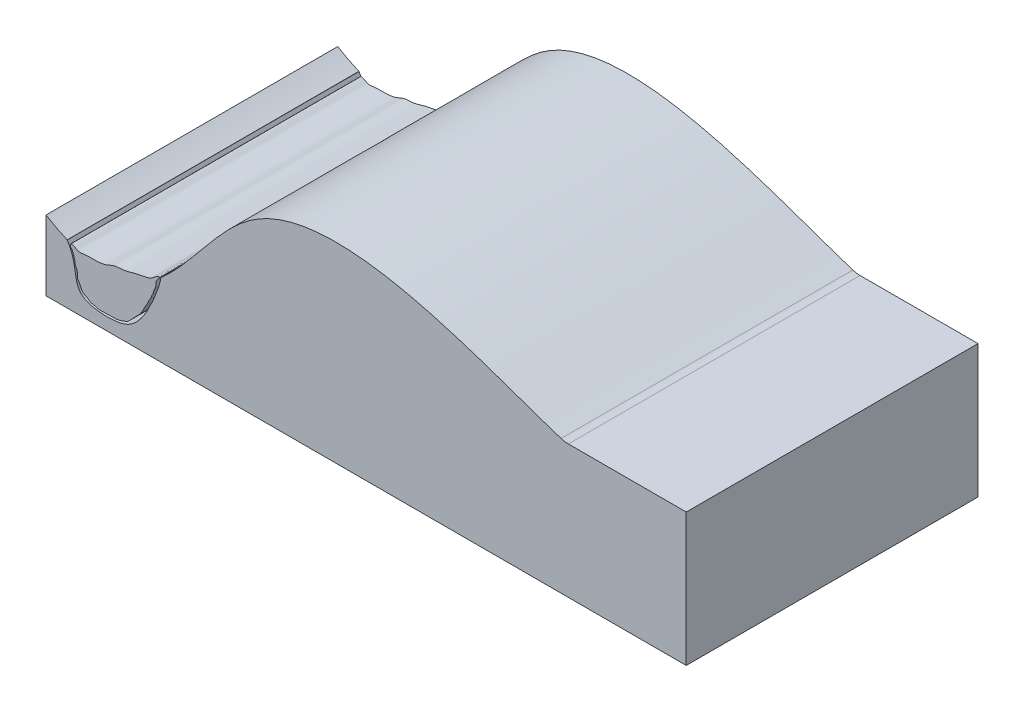
ISO-10303-21;
HEADER;
FILE_DESCRIPTION(('STEP AP214'),'2;1');
FILE_NAME('part.step','',(''),(''),'','','');
FILE_SCHEMA(('AUTOMOTIVE_DESIGN { 1 0 10303 214 1 1 1 1 }'));
ENDSEC;
DATA;
#1=APPLICATION_CONTEXT('core data for automotive mechanical design processes');
#2=APPLICATION_PROTOCOL_DEFINITION('international standard','automotive_design',2000,#1);
#3=PRODUCT_CONTEXT('',#1,'mechanical');
#4=PRODUCT('Part','Part','',(#3));
#5=PRODUCT_RELATED_PRODUCT_CATEGORY('part','',(#4));
#6=PRODUCT_DEFINITION_FORMATION('','',#4);
#7=PRODUCT_DEFINITION_CONTEXT('part definition',#1,'design');
#8=PRODUCT_DEFINITION('design','',#6,#7);
#9=PRODUCT_DEFINITION_SHAPE('','',#8);
#10=(LENGTH_UNIT() NAMED_UNIT(*) SI_UNIT(.MILLI.,.METRE.));
#11=(NAMED_UNIT(*) PLANE_ANGLE_UNIT() SI_UNIT($,.RADIAN.));
#12=(NAMED_UNIT(*) SI_UNIT($,.STERADIAN.) SOLID_ANGLE_UNIT());
#13=UNCERTAINTY_MEASURE_WITH_UNIT(LENGTH_MEASURE(1.E-05),#10,'distance_accuracy_value','');
#14=(GEOMETRIC_REPRESENTATION_CONTEXT(3) GLOBAL_UNCERTAINTY_ASSIGNED_CONTEXT((#13)) GLOBAL_UNIT_ASSIGNED_CONTEXT((#10,
#11,#12)) REPRESENTATION_CONTEXT('',''));
#15=CARTESIAN_POINT('',(0.,0.,0.));
#16=DIRECTION('',(0.,0.,1.));
#17=DIRECTION('',(1.,0.,0.));
#18=AXIS2_PLACEMENT_3D('',#15,#16,#17);
#19=CARTESIAN_POINT('',(18453.120407378,42903.9943873051,-217957.146));
#20=CARTESIAN_POINT('',(18203.1148026914,42439.5432046813,-217957.146));
#21=CARTESIAN_POINT('',(18070.7865840189,41127.0455180154,-217957.146));
#22=CARTESIAN_POINT('',(19282.2145590177,40516.7158260196,-217957.146));
#23=CARTESIAN_POINT('',(19537.7374002564,39469.7636240966,-217957.146));
#24=CARTESIAN_POINT('',(20297.8759646065,38469.1216104898,-217957.146));
#25=CARTESIAN_POINT('',(20759.1419337716,37218.3682673327,-217957.146));
#26=CARTESIAN_POINT('',(21089.9603759941,36107.5250728247,-217957.146));
#27=CARTESIAN_POINT('',(21115.2633461285,35254.8342591941,-217957.146));
#28=CARTESIAN_POINT('',(21460.4638072928,34502.1710613167,-217957.146));
#29=CARTESIAN_POINT('',(21621.4709321931,33635.4798391311,-217957.146));
#30=CARTESIAN_POINT('',(22007.1643704412,32713.1135226253,-217957.146));
#31=CARTESIAN_POINT('',(21931.7260022285,31903.5382757547,-217957.146));
#32=CARTESIAN_POINT('',(21873.2078152518,31131.155966318,-217957.146));
#33=CARTESIAN_POINT('',(22343.2117233786,30428.7305689686,-217957.146));
#34=CARTESIAN_POINT('',(22873.704039919,29744.9815546628,-217957.146));
#35=CARTESIAN_POINT('',(22878.4593514821,28895.8600068504,-217957.146));
#36=CARTESIAN_POINT('',(23660.2442996175,27985.5433933988,-217957.146));
#37=CARTESIAN_POINT('',(23527.0895336415,26476.9018335342,-217957.146));
#38=CARTESIAN_POINT('',(23757.7905491988,24769.5224805877,-217957.146));
#39=CARTESIAN_POINT('',(23527.9884886866,23006.2054731983,-217957.146));
#40=CARTESIAN_POINT('',(25051.1583024233,21270.8784655501,-217957.146));
#41=CARTESIAN_POINT('',(26082.9072055749,19021.3828018486,-217957.146));
#42=CARTESIAN_POINT('',(27304.7137493868,15781.2384394435,-217957.146));
#43=CARTESIAN_POINT('',(30638.8272396351,14774.5947712978,-217957.146));
#44=CARTESIAN_POINT('',(33326.8486721414,12299.9786082345,-217957.146));
#45=CARTESIAN_POINT('',(36520.9117968575,12108.4123723492,-217957.146));
#46=CARTESIAN_POINT('',(39786.728131325,10843.9441147948,-217957.146));
#47=CARTESIAN_POINT('',(43379.518356676,11131.8259705698,-217957.146));
#48=CARTESIAN_POINT('',(47077.0138418892,11118.5373920311,-217957.146));
#49=CARTESIAN_POINT('',(50672.1846078707,11282.3295422937,-217957.146));
#50=CARTESIAN_POINT('',(54454.2648118423,11179.5325122391,-217957.146));
#51=CARTESIAN_POINT('',(57894.7691915825,12644.0029044955,-217957.146));
#52=CARTESIAN_POINT('',(61435.8294770515,13764.8994775494,-217957.146));
#53=CARTESIAN_POINT('',(63729.2647813669,16312.8744576645,-217957.146));
#54=CARTESIAN_POINT('',(66260.075599825,18679.8959949824,-217957.146));
#55=CARTESIAN_POINT('',(68431.7918497825,21204.4500019919,-217957.146));
#56=CARTESIAN_POINT('',(70755.1438688806,23302.3136415229,-217957.146));
#57=CARTESIAN_POINT('',(72158.7838580752,25747.5678485187,-217957.146));
#58=CARTESIAN_POINT('',(73690.9638617059,28196.472307104,-217957.146));
#59=CARTESIAN_POINT('',(74618.2784756751,30683.6430975391,-217957.146));
#60=CARTESIAN_POINT('',(76552.9934465226,32965.4591929348,-217957.146));
#61=CARTESIAN_POINT('',(76995.7119309682,35793.4659308945,-217957.146));
#62=CARTESIAN_POINT('',(79031.0750282337,37598.4746489586,-217957.146));
#63=CARTESIAN_POINT('',(79194.0937732828,39860.4056586141,-217957.146));
#64=CARTESIAN_POINT('',(80640.1146720713,41164.4277622982,-217957.146));
#65=CARTESIAN_POINT('',(80694.097635989,43387.6648043391,-217957.146));
#66=CARTESIAN_POINT('',(81786.1815944237,45027.4304780346,-217957.146));
#67=CARTESIAN_POINT('',(82536.5594614461,46912.3623427988,-217957.146));
#68=CARTESIAN_POINT('',(82652.2091346204,48852.6132211194,-217957.146));
#69=CARTESIAN_POINT('',(82687.6500420254,51130.4422403183,-217957.146));
#70=CARTESIAN_POINT('',(84079.8289475113,52690.5612934202,-217957.146));
#71=CARTESIAN_POINT('',(86286.3839748042,55943.792197896,-217957.146));
#72=CARTESIAN_POINT('',(81449.8345280388,53125.8907607155,-217957.146));
#73=CARTESIAN_POINT('',(78836.8328627755,50436.5980074668,-217957.146));
#74=CARTESIAN_POINT('',(72346.051931403,49244.9439620969,-217957.146));
#75=CARTESIAN_POINT('',(65378.1528514533,47875.2527393667,-217957.146));
#76=CARTESIAN_POINT('',(58555.2407215721,45493.8790615314,-217957.146));
#77=CARTESIAN_POINT('',(51483.2006106164,45890.3030960841,-217957.146));
#78=CARTESIAN_POINT('',(45520.1415024761,42410.2060821301,-217957.146));
#79=CARTESIAN_POINT('',(37537.5175407025,41407.4955008268,-217957.146));
#80=CARTESIAN_POINT('',(30183.9146566245,41954.9182345952,-217957.146));
#81=CARTESIAN_POINT('',(23962.7542459087,40353.9665108862,-217957.146));
#82=CARTESIAN_POINT('',(19279.0411645446,44438.3594784421,-217957.146));
#83=CARTESIAN_POINT('',(18453.120407378,42903.9943873051,-217957.146));
#84=B_SPLINE_CURVE_WITH_KNOTS('',3,(#19,#20,#21,#22,#23,#24,#25,#26,#27,#28,#29,#30,#31,#32,#33,
#34,#35,#36,#37,#38,#39,#40,#41,#42,#43,#44,#45,#46,#47,#48,#49,#50,#51,#52,#53,#54,#55,#56,#57,
#58,#59,#60,#61,#62,#63,#64,#65,#66,#67,#68,#69,#70,#71,#72,#73,#74,#75,#76,#77,#78,#79,#80,#81,
#82,#83),.UNSPECIFIED.,.T.,.F.,(4,1,1,1,1,1,1,1,1,1,1,1,1,1,1,1,1,1,1,1,1,1,1,1,1,1,1,1,1,1,1,1,
1,1,1,1,1,1,1,1,1,1,1,1,1,1,1,1,1,1,1,1,1,1,1,1,1,1,1,1,1,1,4),(0.,0.0097554322366048,
0.0156681170548125,0.020243348716402,0.0266970056659213,0.0362738336504634,0.0420199304411887,
0.0457652070667872,0.0501722621278018,0.0554688831265622,0.0603188689683269,0.0663579460671775,
0.0686806680282739,0.0728356793865483,0.0796945951412897,0.0825203083639413,0.0862655849895397,
0.0984858400073749,0.105469473536518,0.115235960090819,0.126070904107022,0.14123811844707,
0.157032627782526,0.179979428023854,0.19402373519797,0.216107923493983,0.23008291367537,
0.251457004516592,0.274224419490769,0.291418838483833,0.310951811592434,0.335782133048714,
0.352434607869591,0.371184024687874,0.3908929740819,0.409956282113419,0.426055275631748,
0.442160970084193,0.456105042107834,0.473763840380501,0.485488410761632,0.504642066730716,
0.518686373904832,0.527364779335987,0.540272093235025,0.547834328054887,0.562597779794429,
0.572004086820057,0.580879194971791,0.594938859512085,0.606663429893216,0.618936548553727,
0.637852120823782,0.658106469417179,0.694415301906252,0.735783234345221,0.779274613725288,
0.811449134059962,0.849671851168482,0.889231836285604,0.943151013809343,0.967771866596964,1.),.UNSPECIFIED.);
#85=DIRECTION('',(0.,0.,1.));
#86=VECTOR('',#85,1.);
#87=SURFACE_OF_LINEAR_EXTRUSION('',#84,#86);
#88=CARTESIAN_POINT('',(18453.120407378,42903.9943873051,-217957.146));
#89=VERTEX_POINT('',#88);
#90=EDGE_CURVE('E12',#89,#89,#84,.T.);
#91=ORIENTED_EDGE('',*,*,#90,.T.);
#92=EDGE_LOOP('',(#91));
#93=FACE_BOUND('',#92,.T.);
#94=CARTESIAN_POINT('',(18453.120407378,42903.9943873051,0.));
#95=CARTESIAN_POINT('',(18203.1148026914,42439.5432046813,0.));
#96=CARTESIAN_POINT('',(18070.7865840189,41127.0455180154,0.));
#97=CARTESIAN_POINT('',(19282.2145590177,40516.7158260196,0.));
#98=CARTESIAN_POINT('',(19537.7374002564,39469.7636240966,0.));
#99=CARTESIAN_POINT('',(20297.8759646065,38469.1216104898,0.));
#100=CARTESIAN_POINT('',(20759.1419337716,37218.3682673327,0.));
#101=CARTESIAN_POINT('',(21089.9603759941,36107.5250728247,0.));
#102=CARTESIAN_POINT('',(21115.2633461285,35254.8342591941,0.));
#103=CARTESIAN_POINT('',(21460.4638072928,34502.1710613167,0.));
#104=CARTESIAN_POINT('',(21621.4709321931,33635.4798391311,0.));
#105=CARTESIAN_POINT('',(22007.1643704412,32713.1135226253,0.));
#106=CARTESIAN_POINT('',(21931.7260022285,31903.5382757547,0.));
#107=CARTESIAN_POINT('',(21873.2078152518,31131.155966318,0.));
#108=CARTESIAN_POINT('',(22343.2117233786,30428.7305689686,0.));
#109=CARTESIAN_POINT('',(22873.704039919,29744.9815546628,0.));
#110=CARTESIAN_POINT('',(22878.4593514821,28895.8600068504,0.));
#111=CARTESIAN_POINT('',(23660.2442996175,27985.5433933988,0.));
#112=CARTESIAN_POINT('',(23527.0895336415,26476.9018335342,0.));
#113=CARTESIAN_POINT('',(23757.7905491988,24769.5224805877,0.));
#114=CARTESIAN_POINT('',(23527.9884886866,23006.2054731983,0.));
#115=CARTESIAN_POINT('',(25051.1583024233,21270.8784655501,0.));
#116=CARTESIAN_POINT('',(26082.9072055749,19021.3828018486,0.));
#117=CARTESIAN_POINT('',(27304.7137493868,15781.2384394435,0.));
#118=CARTESIAN_POINT('',(30638.8272396351,14774.5947712978,0.));
#119=CARTESIAN_POINT('',(33326.8486721414,12299.9786082345,0.));
#120=CARTESIAN_POINT('',(36520.9117968575,12108.4123723492,0.));
#121=CARTESIAN_POINT('',(39786.728131325,10843.9441147948,0.));
#122=CARTESIAN_POINT('',(43379.518356676,11131.8259705698,0.));
#123=CARTESIAN_POINT('',(47077.0138418892,11118.5373920311,0.));
#124=CARTESIAN_POINT('',(50672.1846078707,11282.3295422937,0.));
#125=CARTESIAN_POINT('',(54454.2648118423,11179.5325122391,0.));
#126=CARTESIAN_POINT('',(57894.7691915825,12644.0029044955,0.));
#127=CARTESIAN_POINT('',(61435.8294770515,13764.8994775494,0.));
#128=CARTESIAN_POINT('',(63729.2647813669,16312.8744576645,0.));
#129=CARTESIAN_POINT('',(66260.075599825,18679.8959949824,0.));
#130=CARTESIAN_POINT('',(68431.7918497825,21204.4500019919,0.));
#131=CARTESIAN_POINT('',(70755.1438688806,23302.3136415229,0.));
#132=CARTESIAN_POINT('',(72158.7838580752,25747.5678485187,0.));
#133=CARTESIAN_POINT('',(73690.9638617059,28196.472307104,0.));
#134=CARTESIAN_POINT('',(74618.2784756751,30683.6430975391,0.));
#135=CARTESIAN_POINT('',(76552.9934465226,32965.4591929348,0.));
#136=CARTESIAN_POINT('',(76995.7119309682,35793.4659308945,0.));
#137=CARTESIAN_POINT('',(79031.0750282337,37598.4746489586,0.));
#138=CARTESIAN_POINT('',(79194.0937732828,39860.4056586141,0.));
#139=CARTESIAN_POINT('',(80640.1146720713,41164.4277622982,0.));
#140=CARTESIAN_POINT('',(80694.097635989,43387.6648043391,0.));
#141=CARTESIAN_POINT('',(81786.1815944237,45027.4304780346,0.));
#142=CARTESIAN_POINT('',(82536.5594614461,46912.3623427988,0.));
#143=CARTESIAN_POINT('',(82652.2091346204,48852.6132211194,0.));
#144=CARTESIAN_POINT('',(82687.6500420254,51130.4422403183,0.));
#145=CARTESIAN_POINT('',(84079.8289475113,52690.5612934202,0.));
#146=CARTESIAN_POINT('',(86286.3839748042,55943.792197896,0.));
#147=CARTESIAN_POINT('',(81449.8345280388,53125.8907607155,0.));
#148=CARTESIAN_POINT('',(78836.8328627755,50436.5980074668,0.));
#149=CARTESIAN_POINT('',(72346.051931403,49244.9439620969,0.));
#150=CARTESIAN_POINT('',(65378.1528514533,47875.2527393667,0.));
#151=CARTESIAN_POINT('',(58555.2407215721,45493.8790615314,0.));
#152=CARTESIAN_POINT('',(51483.2006106164,45890.3030960841,0.));
#153=CARTESIAN_POINT('',(45520.1415024761,42410.2060821301,0.));
#154=CARTESIAN_POINT('',(37537.5175407025,41407.4955008268,0.));
#155=CARTESIAN_POINT('',(30183.9146566245,41954.9182345952,0.));
#156=CARTESIAN_POINT('',(23962.7542459087,40353.9665108862,0.));
#157=CARTESIAN_POINT('',(19279.0411645446,44438.3594784421,0.));
#158=CARTESIAN_POINT('',(18453.120407378,42903.9943873051,0.));
#159=B_SPLINE_CURVE_WITH_KNOTS('',3,(#94,#95,#96,#97,#98,#99,#100,#101,#102,#103,#104,#105,#106,
#107,#108,#109,#110,#111,#112,#113,#114,#115,#116,#117,#118,#119,#120,#121,#122,#123,#124,#125,
#126,#127,#128,#129,#130,#131,#132,#133,#134,#135,#136,#137,#138,#139,#140,#141,#142,#143,#144,
#145,#146,#147,#148,#149,#150,#151,#152,#153,#154,#155,#156,#157,#158),.UNSPECIFIED.,.T.,.F.,(4,
1,1,1,1,1,1,1,1,1,1,1,1,1,1,1,1,1,1,1,1,1,1,1,1,1,1,1,1,1,1,1,1,1,1,1,1,1,1,1,1,1,1,1,1,1,1,1,1,
1,1,1,1,1,1,1,1,1,1,1,1,1,4),(0.,0.0097554322366048,0.0156681170548125,0.020243348716402,
0.0266970056659213,0.0362738336504634,0.0420199304411887,0.0457652070667872,0.0501722621278018,
0.0554688831265622,0.0603188689683269,0.0663579460671775,0.0686806680282739,0.0728356793865483,
0.0796945951412897,0.0825203083639413,0.0862655849895397,0.0984858400073749,0.105469473536518,
0.115235960090819,0.126070904107022,0.14123811844707,0.157032627782526,0.179979428023854,
0.19402373519797,0.216107923493983,0.23008291367537,0.251457004516592,0.274224419490769,
0.291418838483833,0.310951811592434,0.335782133048714,0.352434607869591,0.371184024687874,
0.3908929740819,0.409956282113419,0.426055275631748,0.442160970084193,0.456105042107834,
0.473763840380501,0.485488410761632,0.504642066730716,0.518686373904832,0.527364779335987,
0.540272093235025,0.547834328054887,0.562597779794429,0.572004086820057,0.580879194971791,
0.594938859512085,0.606663429893216,0.618936548553727,0.637852120823782,0.658106469417179,
0.694415301906252,0.735783234345221,0.779274613725288,0.811449134059962,0.849671851168482,
0.889231836285604,0.943151013809343,0.967771866596964,1.),.UNSPECIFIED.);
#160=CARTESIAN_POINT('',(18453.120407378,42903.9943873051,0.));
#161=VERTEX_POINT('',#160);
#162=EDGE_CURVE('E47',#161,#161,#159,.T.);
#163=ORIENTED_EDGE('',*,*,#162,.F.);
#164=EDGE_LOOP('',(#163));
#165=FACE_BOUND('',#164,.T.);
#166=ADVANCED_FACE('F43',(#93,#165),#87,.T.);
#167=CARTESIAN_POINT('',(77089.9721542229,35145.7179828665,-217957.146));
#168=DIRECTION('',(0.,0.,1.));
#169=DIRECTION('',(1.,0.,0.));
#170=AXIS2_PLACEMENT_3D('',#167,#168,#169);
#171=PLANE('',#170);
#172=ORIENTED_EDGE('',*,*,#90,.F.);
#173=EDGE_LOOP('',(#172));
#174=FACE_BOUND('',#173,.T.);
#175=ADVANCED_FACE('F66',(#174),#171,.F.);
#176=CARTESIAN_POINT('',(77089.9721542229,35145.7179828665,0.));
#177=DIRECTION('',(0.,0.,1.));
#178=DIRECTION('',(1.,0.,0.));
#179=AXIS2_PLACEMENT_3D('',#176,#177,#178);
#180=PLANE('',#179);
#181=ORIENTED_EDGE('',*,*,#162,.T.);
#182=EDGE_LOOP('',(#181));
#183=FACE_BOUND('',#182,.T.);
#184=ADVANCED_FACE('F63',(#183),#180,.T.);
#185=CLOSED_SHELL('',(#166,#175,#184));
#186=MANIFOLD_SOLID_BREP('B2',#185);
#187=CARTESIAN_POINT('',(0.,52667.8814282755,-271472.66));
#188=CARTESIAN_POINT('',(83559.6572341252,2393.55245964513,-271472.66));
#189=CARTESIAN_POINT('',(133616.286871643,210787.472707253,-271472.66));
#190=CARTESIAN_POINT('',(330012.548128856,118598.212832559,-271472.66));
#191=CARTESIAN_POINT('',(390144.,99964.3641700831,-271472.66));
#192=B_SPLINE_CURVE_WITH_KNOTS('',3,(#187,#188,#189,#190,#191),.UNSPECIFIED.,.F.,.F.,(4,1,4),
(0.,0.441082236898195,1.),.UNSPECIFIED.);
#193=DIRECTION('',(0.,0.,1.));
#194=VECTOR('',#193,1.);
#195=SURFACE_OF_LINEAR_EXTRUSION('',#192,#194);
#196=CARTESIAN_POINT('',(0.,52667.8814282755,0.));
#197=CARTESIAN_POINT('',(83559.6572341252,2393.55245964513,0.));
#198=CARTESIAN_POINT('',(133616.286871643,210787.472707253,0.));
#199=CARTESIAN_POINT('',(330012.548128856,118598.212832559,0.));
#200=CARTESIAN_POINT('',(390144.,99964.3641700831,0.));
#201=B_SPLINE_CURVE_WITH_KNOTS('',3,(#196,#197,#198,#199,#200),.UNSPECIFIED.,.F.,.F.,(4,1,4),
(0.,0.441082236898195,1.),.UNSPECIFIED.);
#202=CARTESIAN_POINT('',(0.,52667.8814282755,0.));
#203=VERTEX_POINT('',#202);
#204=CARTESIAN_POINT('',(15837.7170689637,44483.9936872826,0.));
#205=VERTEX_POINT('',#204);
#206=EDGE_CURVE('E253',#203,#205,#201,.T.);
#207=ORIENTED_EDGE('',*,*,#206,.T.);
#208=DIRECTION('',(0.,0.,1.));
#209=VECTOR('',#208,1.);
#210=CARTESIAN_POINT('',(15837.7170689637,44483.9936872826,0.));
#211=LINE('',#210,#209);
#212=CARTESIAN_POINT('',(15837.7170689637,44483.9936872826,-219456.));
#213=VERTEX_POINT('',#212);
#214=EDGE_CURVE('E231',#205,#213,#211,.F.);
#215=ORIENTED_EDGE('',*,*,#214,.T.);
#216=CARTESIAN_POINT('',(0.,52667.8814282755,-219456.));
#217=CARTESIAN_POINT('',(83559.6572341252,2393.55245964513,-219456.));
#218=CARTESIAN_POINT('',(133616.286871643,210787.472707253,-219456.));
#219=CARTESIAN_POINT('',(330012.548128856,118598.212832559,-219456.));
#220=CARTESIAN_POINT('',(390144.,99964.3641700831,-219456.));
#221=B_SPLINE_CURVE_WITH_KNOTS('',3,(#216,#217,#218,#219,#220),.UNSPECIFIED.,.F.,.F.,(4,1,4),
(0.,0.441082236898195,1.),.UNSPECIFIED.);
#222=CARTESIAN_POINT('',(0.,52667.8814282755,-219456.));
#223=VERTEX_POINT('',#222);
#224=EDGE_CURVE('E271',#223,#213,#221,.T.);
#225=ORIENTED_EDGE('',*,*,#224,.F.);
#226=DIRECTION('',(0.,0.,1.));
#227=VECTOR('',#226,1.);
#228=CARTESIAN_POINT('',(0.,52667.8814282755,-271472.66));
#229=LINE('',#228,#227);
#230=EDGE_CURVE('E260',#223,#203,#229,.T.);
#231=ORIENTED_EDGE('',*,*,#230,.T.);
#232=EDGE_LOOP('',(#207,#215,#225,#231));
#233=FACE_BOUND('',#232,.T.);
#234=ADVANCED_FACE('F95',(#233),#195,.F.);
#235=CARTESIAN_POINT('',(0.,163624.768,0.));
#236=DIRECTION('',(1.,0.,0.));
#237=DIRECTION('',(0.,0.,-1.));
#238=AXIS2_PLACEMENT_3D('',#235,#236,#237);
#239=PLANE('',#238);
#240=DIRECTION('',(0.,-1.,0.));
#241=VECTOR('',#240,1.);
#242=CARTESIAN_POINT('',(0.,163624.768,0.));
#243=LINE('',#242,#241);
#244=CARTESIAN_POINT('',(0.,0.,0.));
#245=VERTEX_POINT('',#244);
#246=EDGE_CURVE('E177',#203,#245,#243,.T.);
#247=ORIENTED_EDGE('',*,*,#246,.F.);
#248=ORIENTED_EDGE('',*,*,#230,.F.);
#249=DIRECTION('',(0.,-1.,0.));
#250=VECTOR('',#249,1.);
#251=CARTESIAN_POINT('',(0.,163624.768,-219456.));
#252=LINE('',#251,#250);
#253=CARTESIAN_POINT('',(0.,0.,-219456.));
#254=VERTEX_POINT('',#253);
#255=EDGE_CURVE('E247',#223,#254,#252,.T.);
#256=ORIENTED_EDGE('',*,*,#255,.T.);
#257=DIRECTION('',(0.,0.,1.));
#258=VECTOR('',#257,1.);
#259=CARTESIAN_POINT('',(0.,0.,0.));
#260=LINE('',#259,#258);
#261=EDGE_CURVE('E183',#254,#245,#260,.T.);
#262=ORIENTED_EDGE('',*,*,#261,.T.);
#263=EDGE_LOOP('',(#247,#248,#256,#262));
#264=FACE_BOUND('',#263,.T.);
#265=ADVANCED_FACE('F306',(#264),#239,.F.);
#266=CARTESIAN_POINT('',(0.,163624.768,0.));
#267=DIRECTION('',(0.,0.,-1.));
#268=DIRECTION('',(-1.,0.,0.));
#269=AXIS2_PLACEMENT_3D('',#266,#267,#268);
#270=PLANE('',#269);
#271=CARTESIAN_POINT('',(86533.846211252,55279.9380173955,0.));
#272=VERTEX_POINT('',#271);
#273=CARTESIAN_POINT('',(387452.101602293,100809.652295647,0.));
#274=VERTEX_POINT('',#273);
#275=EDGE_CURVE('E251',#272,#274,#201,.T.);
#276=ORIENTED_EDGE('',*,*,#275,.F.);
#277=CARTESIAN_POINT('',(86781.9868071533,54990.8234299639,0.));
#278=DIRECTION('',(0.,0.,-1.));
#279=DIRECTION('',(-1.,0.,0.));
#280=AXIS2_PLACEMENT_3D('',#277,#278,#279);
#281=CIRCLE('',#280,381.);
#282=CARTESIAN_POINT('',(86403.1364166399,55031.2385460443,0.));
#283=VERTEX_POINT('',#282);
#284=EDGE_CURVE('E284',#272,#283,#281,.F.);
#285=ORIENTED_EDGE('',*,*,#284,.T.);
#286=CARTESIAN_POINT('',(15943.9389295738,44438.8014705258,0.));
#287=CARTESIAN_POINT('',(24000.9795622401,32165.0707473389,0.));
#288=CARTESIAN_POINT('',(17610.9447752439,11877.3009277303,0.));
#289=CARTESIAN_POINT('',(53463.0961453246,7585.18350306893,0.));
#290=CARTESIAN_POINT('',(74840.7565307184,15824.6682265008,0.));
#291=CARTESIAN_POINT('',(91313.903548003,64441.1489142759,0.));
#292=CARTESIAN_POINT('',(81506.8274084907,54111.2602985171,0.));
#293=CARTESIAN_POINT('',(76367.1066389326,50845.0289867643,0.));
#294=CARTESIAN_POINT('',(68202.5032877185,44982.0439797142,0.));
#295=CARTESIAN_POINT('',(56865.2681827291,41044.1305606629,0.));
#296=CARTESIAN_POINT('',(45351.2438702843,39680.8730855134,0.));
#297=CARTESIAN_POINT('',(35439.5273063804,39718.4685825858,0.));
#298=CARTESIAN_POINT('',(25773.1917894854,42444.451962246,0.));
#299=CARTESIAN_POINT('',(20914.1159025462,42940.0359625946,0.));
#300=CARTESIAN_POINT('',(14431.7495730972,46625.0992974388,0.));
#301=CARTESIAN_POINT('',(15512.4481788711,45096.1149340074,0.));
#302=CARTESIAN_POINT('',(15943.9389295738,44438.8014705258,0.));
#303=B_SPLINE_CURVE_WITH_KNOTS('',3,(#286,#287,#288,#289,#290,#291,#292,#293,#294,#295,#296,
#297,#298,#299,#300,#301,#302),.UNSPECIFIED.,.T.,.F.,(4,1,1,1,1,1,1,1,1,1,1,1,1,1,4),(0.,
0.165559326181111,0.2822292468609,0.438503589805214,0.608520178236622,0.616398336145814,
0.649041552384504,0.704919284220716,0.77132780570167,0.833559197293323,0.884172895910204,
0.92720111650038,0.979409139789541,0.991133553720695,1.),.UNSPECIFIED.);
#304=CARTESIAN_POINT('',(16007.5970879279,44341.4589258594,0.));
#305=VERTEX_POINT('',#304);
#306=EDGE_CURVE('E194',#305,#283,#303,.T.);
#307=ORIENTED_EDGE('',*,*,#306,.F.);
#308=CARTESIAN_POINT('',(15688.365998993,44133.4865434202,0.));
#309=DIRECTION('',(0.,0.,-1.));
#310=DIRECTION('',(-1.,0.,0.));
#311=AXIS2_PLACEMENT_3D('',#308,#309,#310);
#312=CIRCLE('',#311,381.);
#313=EDGE_CURVE('E282',#305,#205,#312,.F.);
#314=ORIENTED_EDGE('',*,*,#313,.T.);
#315=ORIENTED_EDGE('',*,*,#206,.F.);
#316=ORIENTED_EDGE('',*,*,#246,.T.);
#317=DIRECTION('',(1.,0.,0.));
#318=VECTOR('',#317,1.);
#319=CARTESIAN_POINT('',(0.,0.,0.));
#320=LINE('',#319,#318);
#321=CARTESIAN_POINT('',(481584.,0.,0.));
#322=VERTEX_POINT('',#321);
#323=EDGE_CURVE('E171',#245,#322,#320,.T.);
#324=ORIENTED_EDGE('',*,*,#323,.T.);
#325=DIRECTION('',(0.,-1.,0.));
#326=VECTOR('',#325,1.);
#327=CARTESIAN_POINT('',(481584.,99964.3641700831,0.));
#328=LINE('',#327,#326);
#329=CARTESIAN_POINT('',(481584.,99964.3641700831,0.));
#330=VERTEX_POINT('',#329);
#331=EDGE_CURVE('E174',#330,#322,#328,.T.);
#332=ORIENTED_EDGE('',*,*,#331,.F.);
#333=DIRECTION('',(1.,0.,0.));
#334=VECTOR('',#333,1.);
#335=CARTESIAN_POINT('',(390144.,99964.3641700831,0.));
#336=LINE('',#335,#334);
#337=CARTESIAN_POINT('',(392900.721503155,99964.3641700831,0.));
#338=VERTEX_POINT('',#337);
#339=EDGE_CURVE('E200',#338,#330,#336,.T.);
#340=ORIENTED_EDGE('',*,*,#339,.F.);
#341=CARTESIAN_POINT('',(392900.721503155,117947.564170083,0.));
#342=DIRECTION('',(0.,0.,-1.));
#343=DIRECTION('',(-1.,0.,0.));
#344=AXIS2_PLACEMENT_3D('',#341,#342,#343);
#345=CIRCLE('',#344,17983.2);
#346=EDGE_CURVE('E103',#338,#274,#345,.T.);
#347=ORIENTED_EDGE('',*,*,#346,.T.);
#348=EDGE_LOOP('',(#276,#285,#307,#314,#315,#316,#324,#332,#340,#347));
#349=FACE_BOUND('',#348,.T.);
#350=ADVANCED_FACE('F173',(#349),#270,.F.);
#351=CARTESIAN_POINT('',(0.,163624.768,-219456.));
#352=DIRECTION('',(0.,0.,1.));
#353=DIRECTION('',(1.,0.,0.));
#354=AXIS2_PLACEMENT_3D('',#351,#352,#353);
#355=PLANE('',#354);
#356=CARTESIAN_POINT('',(15943.9389295738,44438.8014705258,-219456.));
#357=CARTESIAN_POINT('',(24000.9795622401,32165.0707473389,-219456.));
#358=CARTESIAN_POINT('',(17610.9447752439,11877.3009277303,-219456.));
#359=CARTESIAN_POINT('',(53463.0961453246,7585.18350306893,-219456.));
#360=CARTESIAN_POINT('',(74840.7565307184,15824.6682265008,-219456.));
#361=CARTESIAN_POINT('',(91313.903548003,64441.1489142759,-219456.));
#362=CARTESIAN_POINT('',(81506.8274084907,54111.2602985171,-219456.));
#363=CARTESIAN_POINT('',(76367.1066389326,50845.0289867643,-219456.));
#364=CARTESIAN_POINT('',(68202.5032877185,44982.0439797142,-219456.));
#365=CARTESIAN_POINT('',(56865.2681827291,41044.1305606629,-219456.));
#366=CARTESIAN_POINT('',(45351.2438702843,39680.8730855134,-219456.));
#367=CARTESIAN_POINT('',(35439.5273063804,39718.4685825858,-219456.));
#368=CARTESIAN_POINT('',(25773.1917894854,42444.451962246,-219456.));
#369=CARTESIAN_POINT('',(20914.1159025462,42940.0359625946,-219456.));
#370=CARTESIAN_POINT('',(14431.7495730972,46625.0992974388,-219456.));
#371=CARTESIAN_POINT('',(15512.4481788711,45096.1149340074,-219456.));
#372=CARTESIAN_POINT('',(15943.9389295738,44438.8014705258,-219456.));
#373=B_SPLINE_CURVE_WITH_KNOTS('',3,(#356,#357,#358,#359,#360,#361,#362,#363,#364,#365,#366,
#367,#368,#369,#370,#371,#372),.UNSPECIFIED.,.T.,.F.,(4,1,1,1,1,1,1,1,1,1,1,1,1,1,4),(0.,
0.165559326181111,0.2822292468609,0.438503589805214,0.608520178236622,0.616398336145814,
0.649041552384504,0.704919284220716,0.77132780570167,0.833559197293323,0.884172895910204,
0.92720111650038,0.979409139789541,0.991133553720695,1.),.UNSPECIFIED.);
#374=CARTESIAN_POINT('',(16007.5970879279,44341.4589258594,-219456.));
#375=VERTEX_POINT('',#374);
#376=CARTESIAN_POINT('',(86403.1364166399,55031.2385460443,-219456.));
#377=VERTEX_POINT('',#376);
#378=EDGE_CURVE('E254',#375,#377,#373,.T.);
#379=ORIENTED_EDGE('',*,*,#378,.T.);
#380=CARTESIAN_POINT('',(86781.9868071533,54990.8234299639,-219456.));
#381=DIRECTION('',(0.,0.,1.));
#382=DIRECTION('',(1.,0.,0.));
#383=AXIS2_PLACEMENT_3D('',#380,#381,#382);
#384=CIRCLE('',#383,381.);
#385=CARTESIAN_POINT('',(86533.846211252,55279.9380173955,-219456.));
#386=VERTEX_POINT('',#385);
#387=EDGE_CURVE('E236',#377,#386,#384,.F.);
#388=ORIENTED_EDGE('',*,*,#387,.T.);
#389=CARTESIAN_POINT('',(387452.101602293,100809.652295647,-219456.));
#390=VERTEX_POINT('',#389);
#391=EDGE_CURVE('E219',#386,#390,#221,.T.);
#392=ORIENTED_EDGE('',*,*,#391,.T.);
#393=CARTESIAN_POINT('',(392900.721503155,117947.564170083,-219456.));
#394=DIRECTION('',(0.,0.,1.));
#395=DIRECTION('',(1.,0.,0.));
#396=AXIS2_PLACEMENT_3D('',#393,#394,#395);
#397=CIRCLE('',#396,17983.2);
#398=CARTESIAN_POINT('',(392900.721503155,99964.3641700831,-219456.));
#399=VERTEX_POINT('',#398);
#400=EDGE_CURVE('E41',#390,#399,#397,.T.);
#401=ORIENTED_EDGE('',*,*,#400,.T.);
#402=DIRECTION('',(1.,0.,0.));
#403=VECTOR('',#402,1.);
#404=CARTESIAN_POINT('',(390144.,99964.3641700831,-219456.));
#405=LINE('',#404,#403);
#406=CARTESIAN_POINT('',(481584.,99964.3641700831,-219456.));
#407=VERTEX_POINT('',#406);
#408=EDGE_CURVE('E216',#399,#407,#405,.T.);
#409=ORIENTED_EDGE('',*,*,#408,.T.);
#410=DIRECTION('',(0.,1.,0.));
#411=VECTOR('',#410,1.);
#412=CARTESIAN_POINT('',(481584.,99964.3641700831,-219456.));
#413=LINE('',#412,#411);
#414=CARTESIAN_POINT('',(481584.,0.,-219456.));
#415=VERTEX_POINT('',#414);
#416=EDGE_CURVE('E198',#415,#407,#413,.T.);
#417=ORIENTED_EDGE('',*,*,#416,.F.);
#418=DIRECTION('',(-1.,0.,0.));
#419=VECTOR('',#418,1.);
#420=CARTESIAN_POINT('',(0.,0.,-219456.));
#421=LINE('',#420,#419);
#422=EDGE_CURVE('E182',#415,#254,#421,.T.);
#423=ORIENTED_EDGE('',*,*,#422,.T.);
#424=ORIENTED_EDGE('',*,*,#255,.F.);
#425=ORIENTED_EDGE('',*,*,#224,.T.);
#426=CARTESIAN_POINT('',(15688.365998993,44133.4865434202,-219456.));
#427=DIRECTION('',(0.,0.,1.));
#428=DIRECTION('',(1.,0.,0.));
#429=AXIS2_PLACEMENT_3D('',#426,#427,#428);
#430=CIRCLE('',#429,381.);
#431=EDGE_CURVE('E242',#213,#375,#430,.F.);
#432=ORIENTED_EDGE('',*,*,#431,.T.);
#433=EDGE_LOOP('',(#379,#388,#392,#401,#409,#417,#423,#424,#425,#432));
#434=FACE_BOUND('',#433,.T.);
#435=ADVANCED_FACE('F292',(#434),#355,.F.);
#436=CARTESIAN_POINT('',(0.,0.,0.));
#437=DIRECTION('',(0.,-1.,0.));
#438=DIRECTION('',(0.,0.,-1.));
#439=AXIS2_PLACEMENT_3D('',#436,#437,#438);
#440=PLANE('',#439);
#441=ORIENTED_EDGE('',*,*,#261,.F.);
#442=ORIENTED_EDGE('',*,*,#422,.F.);
#443=DIRECTION('',(0.,0.,-1.));
#444=VECTOR('',#443,1.);
#445=CARTESIAN_POINT('',(481584.,0.,0.));
#446=LINE('',#445,#444);
#447=EDGE_CURVE('E190',#322,#415,#446,.T.);
#448=ORIENTED_EDGE('',*,*,#447,.F.);
#449=ORIENTED_EDGE('',*,*,#323,.F.);
#450=EDGE_LOOP('',(#441,#442,#448,#449));
#451=FACE_BOUND('',#450,.T.);
#452=ADVANCED_FACE('F196',(#451),#440,.T.);
#453=ORIENTED_EDGE('',*,*,#275,.T.);
#454=DIRECTION('',(0.,0.,1.));
#455=VECTOR('',#454,1.);
#456=CARTESIAN_POINT('',(387452.101602293,100809.652295647,0.));
#457=LINE('',#456,#455);
#458=EDGE_CURVE('E116',#274,#390,#457,.F.);
#459=ORIENTED_EDGE('',*,*,#458,.T.);
#460=ORIENTED_EDGE('',*,*,#391,.F.);
#461=DIRECTION('',(0.,0.,1.));
#462=VECTOR('',#461,1.);
#463=CARTESIAN_POINT('',(86533.846211252,55279.9380173955,-219456.));
#464=LINE('',#463,#462);
#465=EDGE_CURVE('E276',#386,#272,#464,.T.);
#466=ORIENTED_EDGE('',*,*,#465,.T.);
#467=EDGE_LOOP('',(#453,#459,#460,#466));
#468=FACE_BOUND('',#467,.T.);
#469=ADVANCED_FACE('F311',(#468),#195,.F.);
#470=CARTESIAN_POINT('',(15943.9389295738,44438.8014705258,-346295.98));
#471=CARTESIAN_POINT('',(24000.9795622401,32165.0707473389,-346295.98));
#472=CARTESIAN_POINT('',(17610.9447752439,11877.3009277303,-346295.98));
#473=CARTESIAN_POINT('',(53463.0961453246,7585.18350306893,-346295.98));
#474=CARTESIAN_POINT('',(74840.7565307184,15824.6682265008,-346295.98));
#475=CARTESIAN_POINT('',(91313.903548003,64441.1489142759,-346295.98));
#476=CARTESIAN_POINT('',(81506.8274084907,54111.2602985171,-346295.98));
#477=CARTESIAN_POINT('',(76367.1066389326,50845.0289867643,-346295.98));
#478=CARTESIAN_POINT('',(68202.5032877185,44982.0439797142,-346295.98));
#479=CARTESIAN_POINT('',(56865.2681827291,41044.1305606629,-346295.98));
#480=CARTESIAN_POINT('',(45351.2438702843,39680.8730855134,-346295.98));
#481=CARTESIAN_POINT('',(35439.5273063804,39718.4685825858,-346295.98));
#482=CARTESIAN_POINT('',(25773.1917894854,42444.451962246,-346295.98));
#483=CARTESIAN_POINT('',(20914.1159025462,42940.0359625946,-346295.98));
#484=CARTESIAN_POINT('',(14431.7495730972,46625.0992974388,-346295.98));
#485=CARTESIAN_POINT('',(15512.4481788711,45096.1149340074,-346295.98));
#486=CARTESIAN_POINT('',(15943.9389295738,44438.8014705258,-346295.98));
#487=B_SPLINE_CURVE_WITH_KNOTS('',3,(#470,#471,#472,#473,#474,#475,#476,#477,#478,#479,#480,
#481,#482,#483,#484,#485,#486),.UNSPECIFIED.,.T.,.F.,(4,1,1,1,1,1,1,1,1,1,1,1,1,1,4),(0.,
0.165559326181111,0.2822292468609,0.438503589805214,0.608520178236622,0.616398336145814,
0.649041552384504,0.704919284220716,0.77132780570167,0.833559197293323,0.884172895910204,
0.92720111650038,0.979409139789541,0.991133553720695,1.),.UNSPECIFIED.);
#488=DIRECTION('',(0.,0.,1.));
#489=VECTOR('',#488,1.);
#490=SURFACE_OF_LINEAR_EXTRUSION('',#487,#489);
#491=ORIENTED_EDGE('',*,*,#306,.T.);
#492=DIRECTION('',(0.,0.,1.));
#493=VECTOR('',#492,1.);
#494=CARTESIAN_POINT('',(86403.1364166399,55031.2385460443,0.));
#495=LINE('',#494,#493);
#496=EDGE_CURVE('E288',#283,#377,#495,.F.);
#497=ORIENTED_EDGE('',*,*,#496,.T.);
#498=ORIENTED_EDGE('',*,*,#378,.F.);
#499=DIRECTION('',(0.,0.,1.));
#500=VECTOR('',#499,1.);
#501=CARTESIAN_POINT('',(16007.5970879279,44341.4589258594,-219456.));
#502=LINE('',#501,#500);
#503=EDGE_CURVE('E286',#375,#305,#502,.T.);
#504=ORIENTED_EDGE('',*,*,#503,.T.);
#505=EDGE_LOOP('',(#491,#497,#498,#504));
#506=FACE_BOUND('',#505,.T.);
#507=ADVANCED_FACE('F299',(#506),#490,.F.);
#508=CARTESIAN_POINT('',(86781.9868071533,54990.8234299639,-109728.));
#509=DIRECTION('',(0.,0.,1.));
#510=DIRECTION('',(1.,0.,0.));
#511=AXIS2_PLACEMENT_3D('',#508,#509,#510);
#512=CYLINDRICAL_SURFACE('',#511,381.);
#513=ORIENTED_EDGE('',*,*,#387,.F.);
#514=ORIENTED_EDGE('',*,*,#496,.F.);
#515=ORIENTED_EDGE('',*,*,#284,.F.);
#516=ORIENTED_EDGE('',*,*,#465,.F.);
#517=EDGE_LOOP('',(#513,#514,#515,#516));
#518=FACE_BOUND('',#517,.T.);
#519=ADVANCED_FACE('F313',(#518),#512,.T.);
#520=CARTESIAN_POINT('',(15688.365998993,44133.4865434202,-109728.));
#521=DIRECTION('',(0.,0.,1.));
#522=DIRECTION('',(1.,0.,0.));
#523=AXIS2_PLACEMENT_3D('',#520,#521,#522);
#524=CYLINDRICAL_SURFACE('',#523,381.);
#525=ORIENTED_EDGE('',*,*,#313,.F.);
#526=ORIENTED_EDGE('',*,*,#503,.F.);
#527=ORIENTED_EDGE('',*,*,#431,.F.);
#528=ORIENTED_EDGE('',*,*,#214,.F.);
#529=EDGE_LOOP('',(#525,#526,#527,#528));
#530=FACE_BOUND('',#529,.T.);
#531=ADVANCED_FACE('F303',(#530),#524,.T.);
#532=CARTESIAN_POINT('',(481584.,0.,0.));
#533=DIRECTION('',(-1.,0.,0.));
#534=DIRECTION('',(0.,0.,1.));
#535=AXIS2_PLACEMENT_3D('',#532,#533,#534);
#536=PLANE('',#535);
#537=ORIENTED_EDGE('',*,*,#331,.T.);
#538=ORIENTED_EDGE('',*,*,#447,.T.);
#539=ORIENTED_EDGE('',*,*,#416,.T.);
#540=DIRECTION('',(0.,0.,1.));
#541=VECTOR('',#540,1.);
#542=CARTESIAN_POINT('',(481584.,99964.3641700831,0.));
#543=LINE('',#542,#541);
#544=EDGE_CURVE('E193',#407,#330,#543,.T.);
#545=ORIENTED_EDGE('',*,*,#544,.T.);
#546=EDGE_LOOP('',(#537,#538,#539,#545));
#547=FACE_BOUND('',#546,.T.);
#548=ADVANCED_FACE('F188',(#547),#536,.F.);
#549=CARTESIAN_POINT('',(390144.,99964.3641700831,0.));
#550=DIRECTION('',(0.,1.,0.));
#551=DIRECTION('',(0.,0.,1.));
#552=AXIS2_PLACEMENT_3D('',#549,#550,#551);
#553=PLANE('',#552);
#554=ORIENTED_EDGE('',*,*,#408,.F.);
#555=DIRECTION('',(0.,0.,1.));
#556=VECTOR('',#555,1.);
#557=CARTESIAN_POINT('',(392900.721503155,99964.3641700831,0.));
#558=LINE('',#557,#556);
#559=EDGE_CURVE('E224',#399,#338,#558,.T.);
#560=ORIENTED_EDGE('',*,*,#559,.T.);
#561=ORIENTED_EDGE('',*,*,#339,.T.);
#562=ORIENTED_EDGE('',*,*,#544,.F.);
#563=EDGE_LOOP('',(#554,#560,#561,#562));
#564=FACE_BOUND('',#563,.T.);
#565=ADVANCED_FACE('F307',(#564),#553,.T.);
#566=CARTESIAN_POINT('',(392900.721503155,117947.564170083,-109728.));
#567=DIRECTION('',(0.,0.,1.));
#568=DIRECTION('',(1.,0.,0.));
#569=AXIS2_PLACEMENT_3D('',#566,#567,#568);
#570=CYLINDRICAL_SURFACE('',#569,17983.2);
#571=ORIENTED_EDGE('',*,*,#400,.F.);
#572=ORIENTED_EDGE('',*,*,#458,.F.);
#573=ORIENTED_EDGE('',*,*,#346,.F.);
#574=ORIENTED_EDGE('',*,*,#559,.F.);
#575=EDGE_LOOP('',(#571,#572,#573,#574));
#576=FACE_BOUND('',#575,.T.);
#577=ADVANCED_FACE('F97',(#576),#570,.F.);
#578=CLOSED_SHELL('',(#234,#265,#350,#435,#452,#469,#507,#519,#531,#548,#565,#577));
#579=MANIFOLD_SOLID_BREP('B7',#578);
#580=ADVANCED_BREP_SHAPE_REPRESENTATION('',(#18,#186,#579),#14);
#581=SHAPE_DEFINITION_REPRESENTATION(#9,#580);
ENDSEC;
END-ISO-10303-21;
